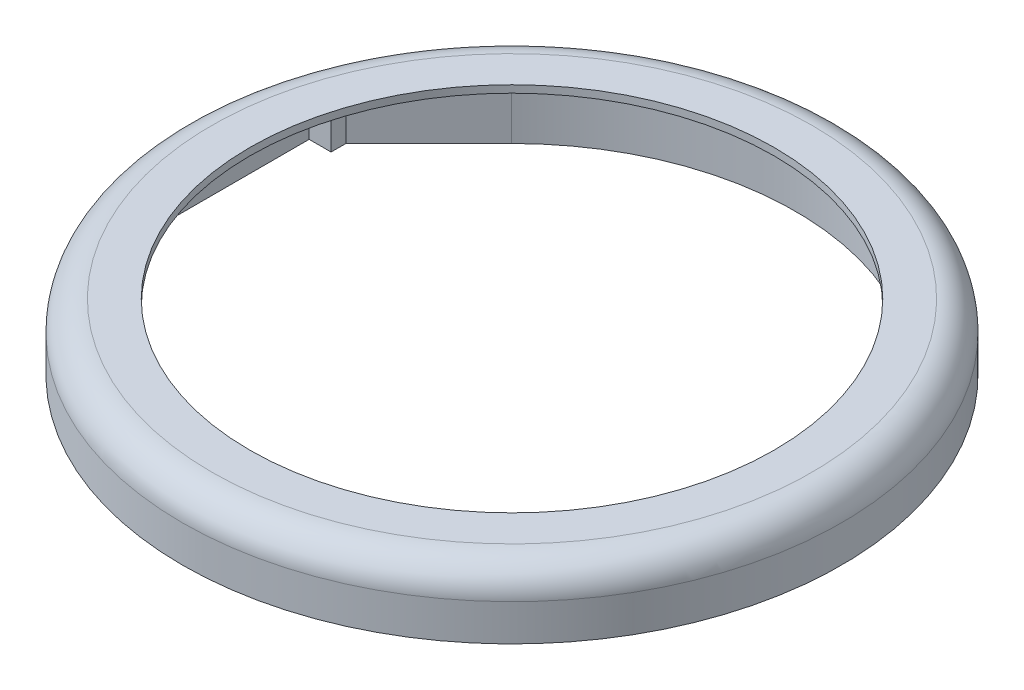
ISO-10303-21;
HEADER;
FILE_DESCRIPTION(('STEP AP214'),'2;1');
FILE_NAME('part.step','',(''),(''),'','','');
FILE_SCHEMA(('AUTOMOTIVE_DESIGN { 1 0 10303 214 1 1 1 1 }'));
ENDSEC;
DATA;
#1=APPLICATION_CONTEXT('core data for automotive mechanical design processes');
#2=APPLICATION_PROTOCOL_DEFINITION('international standard','automotive_design',2000,#1);
#3=PRODUCT_CONTEXT('',#1,'mechanical');
#4=PRODUCT('Part','Part','',(#3));
#5=PRODUCT_RELATED_PRODUCT_CATEGORY('part','',(#4));
#6=PRODUCT_DEFINITION_FORMATION('','',#4);
#7=PRODUCT_DEFINITION_CONTEXT('part definition',#1,'design');
#8=PRODUCT_DEFINITION('design','',#6,#7);
#9=PRODUCT_DEFINITION_SHAPE('','',#8);
#10=(LENGTH_UNIT() NAMED_UNIT(*) SI_UNIT(.MILLI.,.METRE.));
#11=(NAMED_UNIT(*) PLANE_ANGLE_UNIT() SI_UNIT($,.RADIAN.));
#12=(NAMED_UNIT(*) SI_UNIT($,.STERADIAN.) SOLID_ANGLE_UNIT());
#13=UNCERTAINTY_MEASURE_WITH_UNIT(LENGTH_MEASURE(1.E-05),#10,'distance_accuracy_value','');
#14=(GEOMETRIC_REPRESENTATION_CONTEXT(3) GLOBAL_UNCERTAINTY_ASSIGNED_CONTEXT((#13)) GLOBAL_UNIT_ASSIGNED_CONTEXT((#10,
#11,#12)) REPRESENTATION_CONTEXT('',''));
#15=CARTESIAN_POINT('',(0.,0.,0.));
#16=DIRECTION('',(0.,0.,1.));
#17=DIRECTION('',(1.,0.,0.));
#18=AXIS2_PLACEMENT_3D('',#15,#16,#17);
#19=CARTESIAN_POINT('',(19.8,4.,2.50000000000001));
#20=DIRECTION('',(0.,0.,1.));
#21=DIRECTION('',(1.,0.,0.));
#22=AXIS2_PLACEMENT_3D('',#19,#20,#21);
#23=PLANE('',#22);
#24=DIRECTION('',(-1.,0.,0.));
#25=VECTOR('',#24,1.);
#26=CARTESIAN_POINT('',(25.5426406871193,1.,2.5));
#27=LINE('',#26,#25);
#28=CARTESIAN_POINT('',(21.3,1.,2.5));
#29=VERTEX_POINT('',#28);
#30=CARTESIAN_POINT('',(19.8,1.,2.50000000000001));
#31=VERTEX_POINT('',#30);
#32=EDGE_CURVE('E558',#29,#31,#27,.T.);
#33=ORIENTED_EDGE('',*,*,#32,.F.);
#34=DIRECTION('',(0.,-1.,0.));
#35=VECTOR('',#34,1.);
#36=CARTESIAN_POINT('',(21.3,4.,2.5));
#37=LINE('',#36,#35);
#38=CARTESIAN_POINT('',(21.3,0.,2.5));
#39=VERTEX_POINT('',#38);
#40=EDGE_CURVE('E241',#29,#39,#37,.T.);
#41=ORIENTED_EDGE('',*,*,#40,.T.);
#42=DIRECTION('',(-1.,0.,0.));
#43=VECTOR('',#42,1.);
#44=CARTESIAN_POINT('',(19.8,0.,2.50000000000001));
#45=LINE('',#44,#43);
#46=CARTESIAN_POINT('',(19.8,0.,2.50000000000001));
#47=VERTEX_POINT('',#46);
#48=EDGE_CURVE('E251',#39,#47,#45,.T.);
#49=ORIENTED_EDGE('',*,*,#48,.T.);
#50=DIRECTION('',(0.,-1.,0.));
#51=VECTOR('',#50,1.);
#52=CARTESIAN_POINT('',(19.8,4.,2.50000000000001));
#53=LINE('',#52,#51);
#54=EDGE_CURVE('E275',#31,#47,#53,.T.);
#55=ORIENTED_EDGE('',*,*,#54,.F.);
#56=EDGE_LOOP('',(#33,#41,#49,#55));
#57=FACE_BOUND('',#56,.T.);
#58=ADVANCED_FACE('F45',(#57),#23,.F.);
#59=CARTESIAN_POINT('',(19.8,4.,-2.5));
#60=DIRECTION('',(0.,0.,-1.));
#61=DIRECTION('',(-1.,0.,0.));
#62=AXIS2_PLACEMENT_3D('',#59,#60,#61);
#63=PLANE('',#62);
#64=DIRECTION('',(-1.,0.,0.));
#65=VECTOR('',#64,1.);
#66=CARTESIAN_POINT('',(25.5426406871193,0.999999999999999,-2.49999999999999));
#67=LINE('',#66,#65);
#68=CARTESIAN_POINT('',(19.8,0.999999999999999,-2.5));
#69=VERTEX_POINT('',#68);
#70=CARTESIAN_POINT('',(21.3,0.999999999999999,-2.5));
#71=VERTEX_POINT('',#70);
#72=EDGE_CURVE('E553',#69,#71,#67,.F.);
#73=ORIENTED_EDGE('',*,*,#72,.F.);
#74=DIRECTION('',(0.,-1.,0.));
#75=VECTOR('',#74,1.);
#76=CARTESIAN_POINT('',(19.8,4.,-2.5));
#77=LINE('',#76,#75);
#78=CARTESIAN_POINT('',(19.8,0.,-2.5));
#79=VERTEX_POINT('',#78);
#80=EDGE_CURVE('E68',#69,#79,#77,.T.);
#81=ORIENTED_EDGE('',*,*,#80,.T.);
#82=DIRECTION('',(1.,0.,0.));
#83=VECTOR('',#82,1.);
#84=CARTESIAN_POINT('',(19.8,0.,-2.5));
#85=LINE('',#84,#83);
#86=CARTESIAN_POINT('',(21.3,0.,-2.5));
#87=VERTEX_POINT('',#86);
#88=EDGE_CURVE('E495',#79,#87,#85,.T.);
#89=ORIENTED_EDGE('',*,*,#88,.T.);
#90=DIRECTION('',(0.,-1.,0.));
#91=VECTOR('',#90,1.);
#92=CARTESIAN_POINT('',(21.3,4.,-2.5));
#93=LINE('',#92,#91);
#94=EDGE_CURVE('E483',#71,#87,#93,.T.);
#95=ORIENTED_EDGE('',*,*,#94,.F.);
#96=EDGE_LOOP('',(#73,#81,#89,#95));
#97=FACE_BOUND('',#96,.T.);
#98=ADVANCED_FACE('F381',(#97),#63,.F.);
#99=CARTESIAN_POINT('',(-12.8150635094612,4.,-17.1963411006085));
#100=DIRECTION('',(-0.866025403784436,0.,0.500000000000004));
#101=DIRECTION('',(0.500000000000004,0.,0.866025403784436));
#102=AXIS2_PLACEMENT_3D('',#99,#100,#101);
#103=PLANE('',#102);
#104=DIRECTION('',(0.500000000000004,0.,0.866025403784436));
#105=VECTOR('',#104,1.);
#106=CARTESIAN_POINT('',(-14.9363838530208,1.,-20.8705757147833));
#107=LINE('',#106,#105);
#108=CARTESIAN_POINT('',(-12.0650635094612,1.,-15.8973029949318));
#109=VERTEX_POINT('',#108);
#110=CARTESIAN_POINT('',(-12.8150635094612,1.,-17.1963411006085));
#111=VERTEX_POINT('',#110);
#112=EDGE_CURVE('E544',#109,#111,#107,.F.);
#113=ORIENTED_EDGE('',*,*,#112,.F.);
#114=DIRECTION('',(0.,-1.,0.));
#115=VECTOR('',#114,1.);
#116=CARTESIAN_POINT('',(-12.0650635094612,4.,-15.8973029949318));
#117=LINE('',#116,#115);
#118=CARTESIAN_POINT('',(-12.0650635094612,0.,-15.8973029949318));
#119=VERTEX_POINT('',#118);
#120=EDGE_CURVE('E259',#109,#119,#117,.T.);
#121=ORIENTED_EDGE('',*,*,#120,.T.);
#122=DIRECTION('',(-0.500000000000004,0.,-0.866025403784436));
#123=VECTOR('',#122,1.);
#124=CARTESIAN_POINT('',(-12.8150635094612,0.,-17.1963411006085));
#125=LINE('',#124,#123);
#126=CARTESIAN_POINT('',(-12.8150635094612,0.,-17.1963411006085));
#127=VERTEX_POINT('',#126);
#128=EDGE_CURVE('E272',#119,#127,#125,.T.);
#129=ORIENTED_EDGE('',*,*,#128,.T.);
#130=DIRECTION('',(0.,-1.,0.));
#131=VECTOR('',#130,1.);
#132=CARTESIAN_POINT('',(-12.8150635094612,4.,-17.1963411006085));
#133=LINE('',#132,#131);
#134=EDGE_CURVE('E252',#111,#127,#133,.T.);
#135=ORIENTED_EDGE('',*,*,#134,.F.);
#136=EDGE_LOOP('',(#113,#121,#129,#135));
#137=FACE_BOUND('',#136,.T.);
#138=ADVANCED_FACE('F388',(#137),#103,.F.);
#139=CARTESIAN_POINT('',(-8.484936490539,4.,-19.6963411006085));
#140=DIRECTION('',(0.866025403784434,0.,-0.500000000000007));
#141=DIRECTION('',(-0.500000000000007,0.,-0.866025403784434));
#142=AXIS2_PLACEMENT_3D('',#139,#140,#141);
#143=PLANE('',#142);
#144=DIRECTION('',(0.500000000000004,0.,0.866025403784436));
#145=VECTOR('',#144,1.);
#146=CARTESIAN_POINT('',(-10.6062568340987,1.,-23.3705757147833));
#147=LINE('',#146,#145);
#148=CARTESIAN_POINT('',(-8.484936490539,1.,-19.6963411006085));
#149=VERTEX_POINT('',#148);
#150=CARTESIAN_POINT('',(-7.73493649053899,1.,-18.3973029949319));
#151=VERTEX_POINT('',#150);
#152=EDGE_CURVE('E539',#149,#151,#147,.T.);
#153=ORIENTED_EDGE('',*,*,#152,.F.);
#154=DIRECTION('',(0.,-1.,0.));
#155=VECTOR('',#154,1.);
#156=CARTESIAN_POINT('',(-8.484936490539,4.,-19.6963411006085));
#157=LINE('',#156,#155);
#158=CARTESIAN_POINT('',(-8.484936490539,0.,-19.6963411006085));
#159=VERTEX_POINT('',#158);
#160=EDGE_CURVE('E255',#149,#159,#157,.T.);
#161=ORIENTED_EDGE('',*,*,#160,.T.);
#162=DIRECTION('',(0.500000000000007,0.,0.866025403784434));
#163=VECTOR('',#162,1.);
#164=CARTESIAN_POINT('',(-8.484936490539,0.,-19.6963411006085));
#165=LINE('',#164,#163);
#166=CARTESIAN_POINT('',(-7.73493649053899,0.,-18.3973029949319));
#167=VERTEX_POINT('',#166);
#168=EDGE_CURVE('E265',#159,#167,#165,.T.);
#169=ORIENTED_EDGE('',*,*,#168,.T.);
#170=DIRECTION('',(0.,-1.,0.));
#171=VECTOR('',#170,1.);
#172=CARTESIAN_POINT('',(-7.73493649053899,4.,-18.3973029949319));
#173=LINE('',#172,#171);
#174=EDGE_CURVE('E257',#151,#167,#173,.T.);
#175=ORIENTED_EDGE('',*,*,#174,.F.);
#176=EDGE_LOOP('',(#153,#161,#169,#175));
#177=FACE_BOUND('',#176,.T.);
#178=ADVANCED_FACE('F397',(#177),#143,.F.);
#179=CARTESIAN_POINT('',(-8.48493649053886,4.,19.6963411006086));
#180=DIRECTION('',(0.86602540378444,0.,0.499999999999997));
#181=DIRECTION('',(0.499999999999997,0.,-0.86602540378444));
#182=AXIS2_PLACEMENT_3D('',#179,#180,#181);
#183=PLANE('',#182);
#184=DIRECTION('',(0.499999999999998,0.,-0.86602540378444));
#185=VECTOR('',#184,1.);
#186=CARTESIAN_POINT('',(-10.6062568340985,1.,23.3705757147833));
#187=LINE('',#186,#185);
#188=CARTESIAN_POINT('',(-7.73493649053886,1.,18.3973029949319));
#189=VERTEX_POINT('',#188);
#190=CARTESIAN_POINT('',(-8.48493649053886,1.,19.6963411006086));
#191=VERTEX_POINT('',#190);
#192=EDGE_CURVE('E261',#189,#191,#187,.F.);
#193=ORIENTED_EDGE('',*,*,#192,.F.);
#194=DIRECTION('',(0.,-1.,0.));
#195=VECTOR('',#194,1.);
#196=CARTESIAN_POINT('',(-7.73493649053886,4.,18.3973029949319));
#197=LINE('',#196,#195);
#198=CARTESIAN_POINT('',(-7.73493649053886,0.,18.3973029949319));
#199=VERTEX_POINT('',#198);
#200=EDGE_CURVE('E514',#189,#199,#197,.T.);
#201=ORIENTED_EDGE('',*,*,#200,.T.);
#202=DIRECTION('',(-0.499999999999997,0.,0.86602540378444));
#203=VECTOR('',#202,1.);
#204=CARTESIAN_POINT('',(-8.48493649053886,0.,19.6963411006086));
#205=LINE('',#204,#203);
#206=CARTESIAN_POINT('',(-8.48493649053886,0.,19.6963411006086));
#207=VERTEX_POINT('',#206);
#208=EDGE_CURVE('E509',#199,#207,#205,.T.);
#209=ORIENTED_EDGE('',*,*,#208,.T.);
#210=DIRECTION('',(0.,-1.,0.));
#211=VECTOR('',#210,1.);
#212=CARTESIAN_POINT('',(-8.48493649053886,4.,19.6963411006086));
#213=LINE('',#212,#211);
#214=EDGE_CURVE('E295',#191,#207,#213,.T.);
#215=ORIENTED_EDGE('',*,*,#214,.F.);
#216=EDGE_LOOP('',(#193,#201,#209,#215));
#217=FACE_BOUND('',#216,.T.);
#218=ADVANCED_FACE('F404',(#217),#183,.F.);
#219=CARTESIAN_POINT('',(-12.8150635094611,4.,17.1963411006086));
#220=DIRECTION('',(-0.866025403784439,0.,-0.499999999999999));
#221=DIRECTION('',(-0.499999999999999,0.,0.866025403784439));
#222=AXIS2_PLACEMENT_3D('',#219,#220,#221);
#223=PLANE('',#222);
#224=DIRECTION('',(0.499999999999998,0.,-0.86602540378444));
#225=VECTOR('',#224,1.);
#226=CARTESIAN_POINT('',(-14.9363838530207,1.,20.8705757147833));
#227=LINE('',#226,#225);
#228=CARTESIAN_POINT('',(-12.8150635094611,1.,17.1963411006086));
#229=VERTEX_POINT('',#228);
#230=CARTESIAN_POINT('',(-12.0650635094611,1.,15.8973029949319));
#231=VERTEX_POINT('',#230);
#232=EDGE_CURVE('E531',#229,#231,#227,.T.);
#233=ORIENTED_EDGE('',*,*,#232,.F.);
#234=DIRECTION('',(0.,-1.,0.));
#235=VECTOR('',#234,1.);
#236=CARTESIAN_POINT('',(-12.8150635094611,4.,17.1963411006086));
#237=LINE('',#236,#235);
#238=CARTESIAN_POINT('',(-12.8150635094611,0.,17.1963411006086));
#239=VERTEX_POINT('',#238);
#240=EDGE_CURVE('E60',#229,#239,#237,.T.);
#241=ORIENTED_EDGE('',*,*,#240,.T.);
#242=DIRECTION('',(0.499999999999999,0.,-0.866025403784439));
#243=VECTOR('',#242,1.);
#244=CARTESIAN_POINT('',(-12.8150635094611,0.,17.1963411006086));
#245=LINE('',#244,#243);
#246=CARTESIAN_POINT('',(-12.0650635094611,0.,15.8973029949319));
#247=VERTEX_POINT('',#246);
#248=EDGE_CURVE('E497',#239,#247,#245,.T.);
#249=ORIENTED_EDGE('',*,*,#248,.T.);
#250=DIRECTION('',(0.,-1.,0.));
#251=VECTOR('',#250,1.);
#252=CARTESIAN_POINT('',(-12.0650635094611,4.,15.8973029949319));
#253=LINE('',#252,#251);
#254=EDGE_CURVE('E515',#231,#247,#253,.T.);
#255=ORIENTED_EDGE('',*,*,#254,.F.);
#256=EDGE_LOOP('',(#233,#241,#249,#255));
#257=FACE_BOUND('',#256,.T.);
#258=ADVANCED_FACE('F453',(#257),#223,.F.);
#259=CARTESIAN_POINT('',(0.,4.5,0.));
#260=DIRECTION('',(0.,-1.,0.));
#261=DIRECTION('',(0.,0.,-1.));
#262=AXIS2_PLACEMENT_3D('',#259,#260,#261);
#263=CYLINDRICAL_SURFACE('',#262,22.5);
#264=CARTESIAN_POINT('',(0.,2.5,0.));
#265=DIRECTION('',(0.,1.,0.));
#266=DIRECTION('',(0.,0.,1.));
#267=AXIS2_PLACEMENT_3D('',#264,#265,#266);
#268=CIRCLE('',#267,22.5);
#269=CARTESIAN_POINT('',(0.,2.5,22.5));
#270=VERTEX_POINT('',#269);
#271=EDGE_CURVE('E13',#270,#270,#268,.F.);
#272=ORIENTED_EDGE('',*,*,#271,.T.);
#273=EDGE_LOOP('',(#272));
#274=FACE_BOUND('',#273,.T.);
#275=CARTESIAN_POINT('',(0.,0.,0.));
#276=DIRECTION('',(0.,1.,0.));
#277=DIRECTION('',(0.,0.,1.));
#278=AXIS2_PLACEMENT_3D('',#275,#276,#277);
#279=CIRCLE('',#278,22.5);
#280=CARTESIAN_POINT('',(0.,0.,22.5));
#281=VERTEX_POINT('',#280);
#282=EDGE_CURVE('E353',#281,#281,#279,.T.);
#283=ORIENTED_EDGE('',*,*,#282,.T.);
#284=EDGE_LOOP('',(#283));
#285=FACE_BOUND('',#284,.T.);
#286=ADVANCED_FACE('F449',(#274,#285),#263,.T.);
#287=CARTESIAN_POINT('',(0.,4.5,0.));
#288=DIRECTION('',(0.,1.,0.));
#289=DIRECTION('',(0.,0.,1.));
#290=AXIS2_PLACEMENT_3D('',#287,#288,#289);
#291=PLANE('',#290);
#292=CARTESIAN_POINT('',(0.,4.5,0.));
#293=DIRECTION('',(0.,1.,0.));
#294=DIRECTION('',(0.,0.,1.));
#295=AXIS2_PLACEMENT_3D('',#292,#293,#294);
#296=CIRCLE('',#295,20.5);
#297=CARTESIAN_POINT('',(0.,4.5,20.5));
#298=VERTEX_POINT('',#297);
#299=EDGE_CURVE('E53',#298,#298,#296,.T.);
#300=ORIENTED_EDGE('',*,*,#299,.T.);
#301=EDGE_LOOP('',(#300));
#302=FACE_BOUND('',#301,.T.);
#303=CARTESIAN_POINT('',(0.,4.5,0.));
#304=DIRECTION('',(0.,1.,0.));
#305=DIRECTION('',(0.,0.,1.));
#306=AXIS2_PLACEMENT_3D('',#303,#304,#305);
#307=CIRCLE('',#306,17.9);
#308=CARTESIAN_POINT('',(0.,4.5,17.9));
#309=VERTEX_POINT('',#308);
#310=EDGE_CURVE('E350',#309,#309,#307,.T.);
#311=ORIENTED_EDGE('',*,*,#310,.F.);
#312=EDGE_LOOP('',(#311));
#313=FACE_BOUND('',#312,.T.);
#314=ADVANCED_FACE('F360',(#302,#313),#291,.T.);
#315=CARTESIAN_POINT('',(0.,0.,0.));
#316=DIRECTION('',(0.,1.,0.));
#317=DIRECTION('',(0.,0.,1.));
#318=AXIS2_PLACEMENT_3D('',#315,#316,#317);
#319=PLANE('',#318);
#320=ORIENTED_EDGE('',*,*,#248,.F.);
#321=DIRECTION('',(-0.86602540378444,0.,-0.499999999999998));
#322=VECTOR('',#321,1.);
#323=CARTESIAN_POINT('',(-12.8150635094611,0.,17.1963411006086));
#324=LINE('',#323,#322);
#325=EDGE_CURVE('E496',#207,#239,#324,.T.);
#326=ORIENTED_EDGE('',*,*,#325,.F.);
#327=ORIENTED_EDGE('',*,*,#208,.F.);
#328=DIRECTION('',(0.86602540378444,0.,0.499999999999998));
#329=VECTOR('',#328,1.);
#330=CARTESIAN_POINT('',(-12.0650635094611,0.,15.8973029949319));
#331=LINE('',#330,#329);
#332=EDGE_CURVE('E501',#247,#199,#331,.T.);
#333=ORIENTED_EDGE('',*,*,#332,.F.);
#334=EDGE_LOOP('',(#320,#326,#327,#333));
#335=FACE_BOUND('',#334,.T.);
#336=ORIENTED_EDGE('',*,*,#88,.F.);
#337=DIRECTION('',(0.,0.,-1.));
#338=VECTOR('',#337,1.);
#339=CARTESIAN_POINT('',(19.8,0.,2.50000000000001));
#340=LINE('',#339,#338);
#341=EDGE_CURVE('E481',#47,#79,#340,.T.);
#342=ORIENTED_EDGE('',*,*,#341,.F.);
#343=ORIENTED_EDGE('',*,*,#48,.F.);
#344=DIRECTION('',(0.,0.,1.));
#345=VECTOR('',#344,1.);
#346=CARTESIAN_POINT('',(21.3,0.,2.5));
#347=LINE('',#346,#345);
#348=EDGE_CURVE('E493',#87,#39,#347,.T.);
#349=ORIENTED_EDGE('',*,*,#348,.F.);
#350=EDGE_LOOP('',(#336,#342,#343,#349));
#351=FACE_BOUND('',#350,.T.);
#352=DIRECTION('',(0.866025403784438,0.,-0.500000000000002));
#353=VECTOR('',#352,1.);
#354=CARTESIAN_POINT('',(-12.8150635094612,0.,-17.1963411006085));
#355=LINE('',#354,#353);
#356=EDGE_CURVE('E269',#127,#159,#355,.T.);
#357=ORIENTED_EDGE('',*,*,#356,.F.);
#358=ORIENTED_EDGE('',*,*,#128,.F.);
#359=DIRECTION('',(-0.866025403784436,0.,0.500000000000004));
#360=VECTOR('',#359,1.);
#361=CARTESIAN_POINT('',(-12.0650635094612,0.,-15.8973029949318));
#362=LINE('',#361,#360);
#363=EDGE_CURVE('E262',#167,#119,#362,.T.);
#364=ORIENTED_EDGE('',*,*,#363,.F.);
#365=ORIENTED_EDGE('',*,*,#168,.F.);
#366=EDGE_LOOP('',(#357,#358,#364,#365));
#367=FACE_BOUND('',#366,.T.);
#368=DIRECTION('',(0.,0.,-1.));
#369=VECTOR('',#368,1.);
#370=CARTESIAN_POINT('',(-19.35,0.,-8.));
#371=LINE('',#370,#369);
#372=CARTESIAN_POINT('',(-19.35,0.,-7.));
#373=VERTEX_POINT('',#372);
#374=CARTESIAN_POINT('',(-19.35,0.,-8.));
#375=VERTEX_POINT('',#374);
#376=EDGE_CURVE('E322',#373,#375,#371,.T.);
#377=ORIENTED_EDGE('',*,*,#376,.F.);
#378=DIRECTION('',(1.,0.,0.));
#379=VECTOR('',#378,1.);
#380=CARTESIAN_POINT('',(-19.35,0.,-7.));
#381=LINE('',#380,#379);
#382=CARTESIAN_POINT('',(-20.85,0.,-7.));
#383=VERTEX_POINT('',#382);
#384=EDGE_CURVE('E290',#383,#373,#381,.T.);
#385=ORIENTED_EDGE('',*,*,#384,.F.);
#386=DIRECTION('',(0.,0.,-1.));
#387=VECTOR('',#386,1.);
#388=CARTESIAN_POINT('',(-20.85,0.,7.));
#389=LINE('',#388,#387);
#390=CARTESIAN_POINT('',(-20.85,0.,7.));
#391=VERTEX_POINT('',#390);
#392=EDGE_CURVE('E292',#391,#383,#389,.T.);
#393=ORIENTED_EDGE('',*,*,#392,.F.);
#394=DIRECTION('',(-1.,0.,0.));
#395=VECTOR('',#394,1.);
#396=CARTESIAN_POINT('',(-20.85,0.,7.));
#397=LINE('',#396,#395);
#398=CARTESIAN_POINT('',(-19.35,0.,7.));
#399=VERTEX_POINT('',#398);
#400=EDGE_CURVE('E286',#399,#391,#397,.T.);
#401=ORIENTED_EDGE('',*,*,#400,.F.);
#402=CARTESIAN_POINT('',(-19.35,0.,7.99999999999999));
#403=VERTEX_POINT('',#402);
#404=EDGE_CURVE('E319',#403,#399,#371,.T.);
#405=ORIENTED_EDGE('',*,*,#404,.F.);
#406=DIRECTION('',(-0.706168136899907,0.,-0.708044181126654));
#407=VECTOR('',#406,1.);
#408=CARTESIAN_POINT('',(-19.35,0.,7.99999999999999));
#409=LINE('',#408,#407);
#410=CARTESIAN_POINT('',(-13.7006549048007,0.,13.6643534490132));
#411=VERTEX_POINT('',#410);
#412=EDGE_CURVE('E323',#411,#403,#409,.T.);
#413=ORIENTED_EDGE('',*,*,#412,.F.);
#414=CARTESIAN_POINT('',(0.,0.,0.));
#415=DIRECTION('',(0.,-1.,0.));
#416=DIRECTION('',(0.,0.,-1.));
#417=AXIS2_PLACEMENT_3D('',#414,#415,#416);
#418=CIRCLE('',#417,19.35);
#419=CARTESIAN_POINT('',(-13.7006549048007,0.,-13.6643534490132));
#420=VERTEX_POINT('',#419);
#421=EDGE_CURVE('E315',#420,#411,#418,.T.);
#422=ORIENTED_EDGE('',*,*,#421,.F.);
#423=DIRECTION('',(0.706168136899906,0.,-0.708044181126655));
#424=VECTOR('',#423,1.);
#425=CARTESIAN_POINT('',(-13.7006549048007,0.,-13.6643534490133));
#426=LINE('',#425,#424);
#427=EDGE_CURVE('E316',#375,#420,#426,.T.);
#428=ORIENTED_EDGE('',*,*,#427,.F.);
#429=EDGE_LOOP('',(#377,#385,#393,#401,#405,#413,#422,#428));
#430=FACE_BOUND('',#429,.T.);
#431=ORIENTED_EDGE('',*,*,#282,.F.);
#432=EDGE_LOOP('',(#431));
#433=FACE_BOUND('',#432,.T.);
#434=ADVANCED_FACE('F445',(#335,#351,#367,#430,#433),#319,.F.);
#435=CARTESIAN_POINT('',(0.,0.,0.));
#436=DIRECTION('',(0.,1.,0.));
#437=DIRECTION('',(0.,0.,1.));
#438=AXIS2_PLACEMENT_3D('',#435,#436,#437);
#439=CYLINDRICAL_SURFACE('',#438,17.9);
#440=CARTESIAN_POINT('',(0.,4.,0.));
#441=DIRECTION('',(0.,1.,0.));
#442=DIRECTION('',(0.,0.,1.));
#443=AXIS2_PLACEMENT_3D('',#440,#441,#442);
#444=CIRCLE('',#443,17.9);
#445=CARTESIAN_POINT('',(0.,4.,17.9));
#446=VERTEX_POINT('',#445);
#447=EDGE_CURVE('E349',#446,#446,#444,.F.);
#448=ORIENTED_EDGE('',*,*,#447,.T.);
#449=EDGE_LOOP('',(#448));
#450=FACE_BOUND('',#449,.T.);
#451=ORIENTED_EDGE('',*,*,#310,.T.);
#452=EDGE_LOOP('',(#451));
#453=FACE_BOUND('',#452,.T.);
#454=ADVANCED_FACE('F441',(#450,#453),#439,.F.);
#455=CARTESIAN_POINT('',(0.,4.,0.));
#456=DIRECTION('',(0.,1.,0.));
#457=DIRECTION('',(0.,0.,1.));
#458=AXIS2_PLACEMENT_3D('',#455,#456,#457);
#459=PLANE('',#458);
#460=CARTESIAN_POINT('',(0.,4.,0.));
#461=DIRECTION('',(0.,1.,0.));
#462=DIRECTION('',(0.,0.,1.));
#463=AXIS2_PLACEMENT_3D('',#460,#461,#462);
#464=CIRCLE('',#463,19.35);
#465=CARTESIAN_POINT('',(-13.7006549048007,4.,-13.6643534490133));
#466=VERTEX_POINT('',#465);
#467=CARTESIAN_POINT('',(-13.7006549048007,4.,13.6643534490132));
#468=VERTEX_POINT('',#467);
#469=EDGE_CURVE('E331',#466,#468,#464,.F.);
#470=ORIENTED_EDGE('',*,*,#469,.T.);
#471=DIRECTION('',(-0.706168136899907,0.,-0.708044181126654));
#472=VECTOR('',#471,1.);
#473=CARTESIAN_POINT('',(-19.35,4.,7.99999999999999));
#474=LINE('',#473,#472);
#475=CARTESIAN_POINT('',(-19.35,4.00000000000002,7.99999999999999));
#476=VERTEX_POINT('',#475);
#477=EDGE_CURVE('E318',#468,#476,#474,.T.);
#478=ORIENTED_EDGE('',*,*,#477,.T.);
#479=DIRECTION('',(0.,0.,-1.));
#480=VECTOR('',#479,1.);
#481=CARTESIAN_POINT('',(-19.35,4.,-8.));
#482=LINE('',#481,#480);
#483=CARTESIAN_POINT('',(-19.35,4.,-8.));
#484=VERTEX_POINT('',#483);
#485=EDGE_CURVE('E340',#476,#484,#482,.T.);
#486=ORIENTED_EDGE('',*,*,#485,.T.);
#487=DIRECTION('',(0.706168136899906,0.,-0.708044181126655));
#488=VECTOR('',#487,1.);
#489=CARTESIAN_POINT('',(-13.7006549048007,4.,-13.6643534490133));
#490=LINE('',#489,#488);
#491=EDGE_CURVE('E336',#484,#466,#490,.T.);
#492=ORIENTED_EDGE('',*,*,#491,.T.);
#493=EDGE_LOOP('',(#470,#478,#486,#492));
#494=FACE_BOUND('',#493,.T.);
#495=ORIENTED_EDGE('',*,*,#447,.F.);
#496=EDGE_LOOP('',(#495));
#497=FACE_BOUND('',#496,.T.);
#498=ADVANCED_FACE('F437',(#494,#497),#459,.F.);
#499=CARTESIAN_POINT('',(-19.35,59.2300648638388,7.99999999999999));
#500=DIRECTION('',(-0.708044181126654,0.,0.706168136899907));
#501=DIRECTION('',(0.706168136899907,0.,0.708044181126654));
#502=AXIS2_PLACEMENT_3D('',#499,#500,#501);
#503=PLANE('',#502);
#504=DIRECTION('',(0.,-1.,0.));
#505=VECTOR('',#504,1.);
#506=CARTESIAN_POINT('',(-13.7006549048007,59.2300648638388,13.6643534490132));
#507=LINE('',#506,#505);
#508=EDGE_CURVE('E334',#468,#411,#507,.T.);
#509=ORIENTED_EDGE('',*,*,#508,.T.);
#510=ORIENTED_EDGE('',*,*,#412,.T.);
#511=DIRECTION('',(0.,-1.,0.));
#512=VECTOR('',#511,1.);
#513=CARTESIAN_POINT('',(-19.35,59.2300648638388,7.99999999999999));
#514=LINE('',#513,#512);
#515=EDGE_CURVE('E330',#476,#403,#514,.T.);
#516=ORIENTED_EDGE('',*,*,#515,.F.);
#517=ORIENTED_EDGE('',*,*,#477,.F.);
#518=EDGE_LOOP('',(#509,#510,#516,#517));
#519=FACE_BOUND('',#518,.T.);
#520=ADVANCED_FACE('F433',(#519),#503,.F.);
#521=CARTESIAN_POINT('',(-19.35,59.2300648638388,-8.));
#522=DIRECTION('',(-1.,0.,0.));
#523=DIRECTION('',(0.,0.,1.));
#524=AXIS2_PLACEMENT_3D('',#521,#522,#523);
#525=PLANE('',#524);
#526=DIRECTION('',(0.,0.,1.));
#527=VECTOR('',#526,1.);
#528=CARTESIAN_POINT('',(-19.35,3.2,7.));
#529=LINE('',#528,#527);
#530=CARTESIAN_POINT('',(-19.35,3.2,-7.));
#531=VERTEX_POINT('',#530);
#532=CARTESIAN_POINT('',(-19.35,3.2,7.));
#533=VERTEX_POINT('',#532);
#534=EDGE_CURVE('E308',#531,#533,#529,.T.);
#535=ORIENTED_EDGE('',*,*,#534,.F.);
#536=DIRECTION('',(0.,-1.,0.));
#537=VECTOR('',#536,1.);
#538=CARTESIAN_POINT('',(-19.35,18.0801278403287,-7.));
#539=LINE('',#538,#537);
#540=EDGE_CURVE('E298',#531,#373,#539,.T.);
#541=ORIENTED_EDGE('',*,*,#540,.T.);
#542=ORIENTED_EDGE('',*,*,#376,.T.);
#543=DIRECTION('',(0.,-1.,0.));
#544=VECTOR('',#543,1.);
#545=CARTESIAN_POINT('',(-19.35,59.2300648638388,-8.));
#546=LINE('',#545,#544);
#547=EDGE_CURVE('E339',#484,#375,#546,.T.);
#548=ORIENTED_EDGE('',*,*,#547,.F.);
#549=ORIENTED_EDGE('',*,*,#485,.F.);
#550=ORIENTED_EDGE('',*,*,#515,.T.);
#551=ORIENTED_EDGE('',*,*,#404,.T.);
#552=DIRECTION('',(0.,-1.,0.));
#553=VECTOR('',#552,1.);
#554=CARTESIAN_POINT('',(-19.35,18.0801278403287,7.));
#555=LINE('',#554,#553);
#556=EDGE_CURVE('E307',#533,#399,#555,.T.);
#557=ORIENTED_EDGE('',*,*,#556,.F.);
#558=EDGE_LOOP('',(#535,#541,#542,#548,#549,#550,#551,#557));
#559=FACE_BOUND('',#558,.T.);
#560=ADVANCED_FACE('F429',(#559),#525,.F.);
#561=CARTESIAN_POINT('',(-13.7006549048007,59.2300648638388,-13.6643534490133));
#562=DIRECTION('',(-0.708044181126655,0.,-0.706168136899906));
#563=DIRECTION('',(-0.706168136899906,0.,0.708044181126655));
#564=AXIS2_PLACEMENT_3D('',#561,#562,#563);
#565=PLANE('',#564);
#566=ORIENTED_EDGE('',*,*,#547,.T.);
#567=ORIENTED_EDGE('',*,*,#427,.T.);
#568=DIRECTION('',(0.,-1.,0.));
#569=VECTOR('',#568,1.);
#570=CARTESIAN_POINT('',(-13.7006549048007,59.2300648638388,-13.6643534490133));
#571=LINE('',#570,#569);
#572=EDGE_CURVE('E335',#466,#420,#571,.T.);
#573=ORIENTED_EDGE('',*,*,#572,.F.);
#574=ORIENTED_EDGE('',*,*,#491,.F.);
#575=EDGE_LOOP('',(#566,#567,#573,#574));
#576=FACE_BOUND('',#575,.T.);
#577=ADVANCED_FACE('F425',(#576),#565,.F.);
#578=CARTESIAN_POINT('',(0.,59.2300648638388,0.));
#579=DIRECTION('',(0.,-1.,0.));
#580=DIRECTION('',(0.,0.,-1.));
#581=AXIS2_PLACEMENT_3D('',#578,#579,#580);
#582=CYLINDRICAL_SURFACE('',#581,19.35);
#583=ORIENTED_EDGE('',*,*,#572,.T.);
#584=ORIENTED_EDGE('',*,*,#421,.T.);
#585=ORIENTED_EDGE('',*,*,#508,.F.);
#586=ORIENTED_EDGE('',*,*,#469,.F.);
#587=EDGE_LOOP('',(#583,#584,#585,#586));
#588=FACE_BOUND('',#587,.T.);
#589=ADVANCED_FACE('F421',(#588),#582,.F.);
#590=CARTESIAN_POINT('',(0.,3.2,0.));
#591=DIRECTION('',(0.,1.,0.));
#592=DIRECTION('',(0.,0.,1.));
#593=AXIS2_PLACEMENT_3D('',#590,#591,#592);
#594=PLANE('',#593);
#595=DIRECTION('',(0.,0.,-1.));
#596=VECTOR('',#595,1.);
#597=CARTESIAN_POINT('',(-20.85,3.2,7.));
#598=LINE('',#597,#596);
#599=CARTESIAN_POINT('',(-20.85,3.2,7.));
#600=VERTEX_POINT('',#599);
#601=CARTESIAN_POINT('',(-20.85,3.2,-7.));
#602=VERTEX_POINT('',#601);
#603=EDGE_CURVE('E299',#600,#602,#598,.T.);
#604=ORIENTED_EDGE('',*,*,#603,.T.);
#605=DIRECTION('',(1.,0.,0.));
#606=VECTOR('',#605,1.);
#607=CARTESIAN_POINT('',(-19.35,3.2,-7.));
#608=LINE('',#607,#606);
#609=EDGE_CURVE('E289',#602,#531,#608,.T.);
#610=ORIENTED_EDGE('',*,*,#609,.T.);
#611=ORIENTED_EDGE('',*,*,#534,.T.);
#612=DIRECTION('',(-1.,0.,0.));
#613=VECTOR('',#612,1.);
#614=CARTESIAN_POINT('',(-20.85,3.2,7.));
#615=LINE('',#614,#613);
#616=EDGE_CURVE('E304',#533,#600,#615,.T.);
#617=ORIENTED_EDGE('',*,*,#616,.T.);
#618=EDGE_LOOP('',(#604,#610,#611,#617));
#619=FACE_BOUND('',#618,.T.);
#620=ADVANCED_FACE('F417',(#619),#594,.F.);
#621=CARTESIAN_POINT('',(-19.35,18.0801278403287,-7.));
#622=DIRECTION('',(0.,0.,-1.));
#623=DIRECTION('',(-1.,0.,0.));
#624=AXIS2_PLACEMENT_3D('',#621,#622,#623);
#625=PLANE('',#624);
#626=DIRECTION('',(0.,-1.,0.));
#627=VECTOR('',#626,1.);
#628=CARTESIAN_POINT('',(-20.85,18.0801278403287,-7.));
#629=LINE('',#628,#627);
#630=EDGE_CURVE('E302',#602,#383,#629,.T.);
#631=ORIENTED_EDGE('',*,*,#630,.T.);
#632=ORIENTED_EDGE('',*,*,#384,.T.);
#633=ORIENTED_EDGE('',*,*,#540,.F.);
#634=ORIENTED_EDGE('',*,*,#609,.F.);
#635=EDGE_LOOP('',(#631,#632,#633,#634));
#636=FACE_BOUND('',#635,.T.);
#637=ADVANCED_FACE('F413',(#636),#625,.F.);
#638=CARTESIAN_POINT('',(-20.85,18.0801278403287,7.));
#639=DIRECTION('',(0.,0.,1.));
#640=DIRECTION('',(1.,0.,0.));
#641=AXIS2_PLACEMENT_3D('',#638,#639,#640);
#642=PLANE('',#641);
#643=ORIENTED_EDGE('',*,*,#556,.T.);
#644=ORIENTED_EDGE('',*,*,#400,.T.);
#645=DIRECTION('',(0.,-1.,0.));
#646=VECTOR('',#645,1.);
#647=CARTESIAN_POINT('',(-20.85,18.0801278403287,7.));
#648=LINE('',#647,#646);
#649=EDGE_CURVE('E303',#600,#391,#648,.T.);
#650=ORIENTED_EDGE('',*,*,#649,.F.);
#651=ORIENTED_EDGE('',*,*,#616,.F.);
#652=EDGE_LOOP('',(#643,#644,#650,#651));
#653=FACE_BOUND('',#652,.T.);
#654=ADVANCED_FACE('F376',(#653),#642,.F.);
#655=CARTESIAN_POINT('',(-20.85,18.0801278403287,7.));
#656=DIRECTION('',(-1.,0.,0.));
#657=DIRECTION('',(0.,0.,1.));
#658=AXIS2_PLACEMENT_3D('',#655,#656,#657);
#659=PLANE('',#658);
#660=ORIENTED_EDGE('',*,*,#649,.T.);
#661=ORIENTED_EDGE('',*,*,#392,.T.);
#662=ORIENTED_EDGE('',*,*,#630,.F.);
#663=ORIENTED_EDGE('',*,*,#603,.F.);
#664=EDGE_LOOP('',(#660,#661,#662,#663));
#665=FACE_BOUND('',#664,.T.);
#666=ADVANCED_FACE('F365',(#665),#659,.F.);
#667=CARTESIAN_POINT('',(0.,2.5,0.));
#668=DIRECTION('',(0.,1.,0.));
#669=DIRECTION('',(0.,0.,1.));
#670=AXIS2_PLACEMENT_3D('',#667,#668,#669);
#671=TOROIDAL_SURFACE('',#670,20.5,2.);
#672=ORIENTED_EDGE('',*,*,#271,.F.);
#673=EDGE_LOOP('',(#672));
#674=FACE_BOUND('',#673,.T.);
#675=ORIENTED_EDGE('',*,*,#299,.F.);
#676=EDGE_LOOP('',(#675));
#677=FACE_BOUND('',#676,.T.);
#678=ADVANCED_FACE('F47',(#674,#677),#671,.T.);
#679=CARTESIAN_POINT('',(-12.0650635094612,4.,-15.8973029949318));
#680=DIRECTION('',(0.500000000000004,0.,0.866025403784436));
#681=DIRECTION('',(0.866025403784436,0.,-0.500000000000004));
#682=AXIS2_PLACEMENT_3D('',#679,#680,#681);
#683=PLANE('',#682);
#684=DIRECTION('',(-0.866025403784436,0.,0.500000000000004));
#685=VECTOR('',#684,1.);
#686=CARTESIAN_POINT('',(-12.0650635094612,4.,-15.8973029949318));
#687=LINE('',#686,#685);
#688=CARTESIAN_POINT('',(-7.73493649053899,4.,-18.3973029949319));
#689=VERTEX_POINT('',#688);
#690=CARTESIAN_POINT('',(-12.0650635094612,4.,-15.8973029949318));
#691=VERTEX_POINT('',#690);
#692=EDGE_CURVE('E254',#689,#691,#687,.T.);
#693=ORIENTED_EDGE('',*,*,#692,.F.);
#694=CARTESIAN_POINT('',(-7.73493649053899,2.5,-18.3973029949319));
#695=DIRECTION('',(-0.500000000000004,0.,-0.866025403784436));
#696=DIRECTION('',(-0.866025403784436,0.,0.500000000000004));
#697=AXIS2_PLACEMENT_3D('',#694,#695,#696);
#698=CIRCLE('',#697,1.5);
#699=EDGE_CURVE('E550',#689,#151,#698,.T.);
#700=ORIENTED_EDGE('',*,*,#699,.T.);
#701=ORIENTED_EDGE('',*,*,#174,.T.);
#702=ORIENTED_EDGE('',*,*,#363,.T.);
#703=ORIENTED_EDGE('',*,*,#120,.F.);
#704=CARTESIAN_POINT('',(-12.0650635094612,2.5,-15.8973029949318));
#705=DIRECTION('',(-0.500000000000004,0.,-0.866025403784436));
#706=DIRECTION('',(-0.866025403784436,0.,0.500000000000004));
#707=AXIS2_PLACEMENT_3D('',#704,#705,#706);
#708=CIRCLE('',#707,1.5);
#709=EDGE_CURVE('E547',#109,#691,#708,.T.);
#710=ORIENTED_EDGE('',*,*,#709,.T.);
#711=EDGE_LOOP('',(#693,#700,#701,#702,#703,#710));
#712=FACE_BOUND('',#711,.T.);
#713=ADVANCED_FACE('F364',(#712),#683,.F.);
#714=CARTESIAN_POINT('',(-12.8150635094612,4.,-17.1963411006085));
#715=DIRECTION('',(-0.500000000000002,0.,-0.866025403784438));
#716=DIRECTION('',(-0.866025403784438,0.,0.500000000000002));
#717=AXIS2_PLACEMENT_3D('',#714,#715,#716);
#718=PLANE('',#717);
#719=ORIENTED_EDGE('',*,*,#160,.F.);
#720=CARTESIAN_POINT('',(-8.48493649053899,2.5,-19.6963411006085));
#721=DIRECTION('',(-0.500000000000002,0.,-0.866025403784438));
#722=DIRECTION('',(-0.866025403784438,0.,0.500000000000002));
#723=AXIS2_PLACEMENT_3D('',#720,#721,#722);
#724=CIRCLE('',#723,1.5);
#725=CARTESIAN_POINT('',(-8.48493649053899,4.,-19.6963411006085));
#726=VERTEX_POINT('',#725);
#727=EDGE_CURVE('E546',#726,#149,#724,.T.);
#728=ORIENTED_EDGE('',*,*,#727,.F.);
#729=DIRECTION('',(0.866025403784438,0.,-0.500000000000002));
#730=VECTOR('',#729,1.);
#731=CARTESIAN_POINT('',(-12.8150635094612,4.,-17.1963411006085));
#732=LINE('',#731,#730);
#733=CARTESIAN_POINT('',(-12.8150635094612,4.,-17.1963411006085));
#734=VERTEX_POINT('',#733);
#735=EDGE_CURVE('E281',#734,#726,#732,.T.);
#736=ORIENTED_EDGE('',*,*,#735,.F.);
#737=CARTESIAN_POINT('',(-12.8150635094612,2.5,-17.1963411006085));
#738=DIRECTION('',(-0.500000000000002,0.,-0.866025403784438));
#739=DIRECTION('',(-0.866025403784438,0.,0.500000000000002));
#740=AXIS2_PLACEMENT_3D('',#737,#738,#739);
#741=CIRCLE('',#740,1.5);
#742=EDGE_CURVE('E551',#111,#734,#741,.T.);
#743=ORIENTED_EDGE('',*,*,#742,.F.);
#744=ORIENTED_EDGE('',*,*,#134,.T.);
#745=ORIENTED_EDGE('',*,*,#356,.T.);
#746=EDGE_LOOP('',(#719,#728,#736,#743,#744,#745));
#747=FACE_BOUND('',#746,.T.);
#748=ADVANCED_FACE('F372',(#747),#718,.F.);
#749=CARTESIAN_POINT('',(0.,4.,0.));
#750=DIRECTION('',(0.,1.,0.));
#751=DIRECTION('',(0.,0.,1.));
#752=AXIS2_PLACEMENT_3D('',#749,#750,#751);
#753=PLANE('',#752);
#754=DIRECTION('',(-0.500000000000004,0.,-0.866025403784436));
#755=VECTOR('',#754,1.);
#756=CARTESIAN_POINT('',(-12.8150635094612,4.,-17.1963411006085));
#757=LINE('',#756,#755);
#758=EDGE_CURVE('E266',#691,#734,#757,.T.);
#759=ORIENTED_EDGE('',*,*,#758,.T.);
#760=ORIENTED_EDGE('',*,*,#735,.T.);
#761=DIRECTION('',(0.500000000000007,0.,0.866025403784434));
#762=VECTOR('',#761,1.);
#763=CARTESIAN_POINT('',(-8.484936490539,4.,-19.6963411006085));
#764=LINE('',#763,#762);
#765=EDGE_CURVE('E278',#726,#689,#764,.T.);
#766=ORIENTED_EDGE('',*,*,#765,.T.);
#767=ORIENTED_EDGE('',*,*,#692,.T.);
#768=EDGE_LOOP('',(#759,#760,#766,#767));
#769=FACE_BOUND('',#768,.T.);
#770=ADVANCED_FACE('F401',(#769),#753,.F.);
#771=CARTESIAN_POINT('',(19.8,4.,2.50000000000001));
#772=DIRECTION('',(-1.,0.,0.));
#773=DIRECTION('',(0.,0.,1.));
#774=AXIS2_PLACEMENT_3D('',#771,#772,#773);
#775=PLANE('',#774);
#776=ORIENTED_EDGE('',*,*,#80,.F.);
#777=CARTESIAN_POINT('',(19.8,2.5,-2.5));
#778=DIRECTION('',(1.,0.,0.));
#779=DIRECTION('',(0.,0.,-1.));
#780=AXIS2_PLACEMENT_3D('',#777,#778,#779);
#781=CIRCLE('',#780,1.5);
#782=CARTESIAN_POINT('',(19.8,4.,-2.5));
#783=VERTEX_POINT('',#782);
#784=EDGE_CURVE('E479',#69,#783,#781,.T.);
#785=ORIENTED_EDGE('',*,*,#784,.T.);
#786=DIRECTION('',(0.,0.,-1.));
#787=VECTOR('',#786,1.);
#788=CARTESIAN_POINT('',(19.8,4.,2.50000000000001));
#789=LINE('',#788,#787);
#790=CARTESIAN_POINT('',(19.8,4.,2.50000000000001));
#791=VERTEX_POINT('',#790);
#792=EDGE_CURVE('E246',#791,#783,#789,.T.);
#793=ORIENTED_EDGE('',*,*,#792,.F.);
#794=CARTESIAN_POINT('',(19.8,2.5,2.50000000000001));
#795=DIRECTION('',(1.,0.,0.));
#796=DIRECTION('',(0.,0.,-1.));
#797=AXIS2_PLACEMENT_3D('',#794,#795,#796);
#798=CIRCLE('',#797,1.5);
#799=EDGE_CURVE('E227',#791,#31,#798,.T.);
#800=ORIENTED_EDGE('',*,*,#799,.T.);
#801=ORIENTED_EDGE('',*,*,#54,.T.);
#802=ORIENTED_EDGE('',*,*,#341,.T.);
#803=EDGE_LOOP('',(#776,#785,#793,#800,#801,#802));
#804=FACE_BOUND('',#803,.T.);
#805=ADVANCED_FACE('F408',(#804),#775,.F.);
#806=CARTESIAN_POINT('',(21.3,4.,2.5));
#807=DIRECTION('',(1.,0.,0.));
#808=DIRECTION('',(0.,0.,-1.));
#809=AXIS2_PLACEMENT_3D('',#806,#807,#808);
#810=PLANE('',#809);
#811=DIRECTION('',(0.,0.,1.));
#812=VECTOR('',#811,1.);
#813=CARTESIAN_POINT('',(21.3,4.,2.5));
#814=LINE('',#813,#812);
#815=CARTESIAN_POINT('',(21.3,4.,-2.5));
#816=VERTEX_POINT('',#815);
#817=CARTESIAN_POINT('',(21.3,4.,2.50000000000001));
#818=VERTEX_POINT('',#817);
#819=EDGE_CURVE('E232',#816,#818,#814,.T.);
#820=ORIENTED_EDGE('',*,*,#819,.F.);
#821=CARTESIAN_POINT('',(21.3,2.5,-2.5));
#822=DIRECTION('',(1.,0.,0.));
#823=DIRECTION('',(0.,0.,-1.));
#824=AXIS2_PLACEMENT_3D('',#821,#822,#823);
#825=CIRCLE('',#824,1.5);
#826=EDGE_CURVE('E560',#71,#816,#825,.T.);
#827=ORIENTED_EDGE('',*,*,#826,.F.);
#828=ORIENTED_EDGE('',*,*,#94,.T.);
#829=ORIENTED_EDGE('',*,*,#348,.T.);
#830=ORIENTED_EDGE('',*,*,#40,.F.);
#831=CARTESIAN_POINT('',(21.3,2.5,2.50000000000001));
#832=DIRECTION('',(1.,0.,0.));
#833=DIRECTION('',(0.,0.,-1.));
#834=AXIS2_PLACEMENT_3D('',#831,#832,#833);
#835=CIRCLE('',#834,1.5);
#836=EDGE_CURVE('E224',#818,#29,#835,.T.);
#837=ORIENTED_EDGE('',*,*,#836,.F.);
#838=EDGE_LOOP('',(#820,#827,#828,#829,#830,#837));
#839=FACE_BOUND('',#838,.T.);
#840=ADVANCED_FACE('F237',(#839),#810,.F.);
#841=CARTESIAN_POINT('',(0.,4.,0.));
#842=DIRECTION('',(0.,-1.,0.));
#843=DIRECTION('',(0.,0.,-1.));
#844=AXIS2_PLACEMENT_3D('',#841,#842,#843);
#845=PLANE('',#844);
#846=ORIENTED_EDGE('',*,*,#792,.T.);
#847=DIRECTION('',(1.,0.,0.));
#848=VECTOR('',#847,1.);
#849=CARTESIAN_POINT('',(19.8,4.,-2.5));
#850=LINE('',#849,#848);
#851=EDGE_CURVE('E244',#783,#816,#850,.T.);
#852=ORIENTED_EDGE('',*,*,#851,.T.);
#853=ORIENTED_EDGE('',*,*,#819,.T.);
#854=DIRECTION('',(-1.,0.,0.));
#855=VECTOR('',#854,1.);
#856=CARTESIAN_POINT('',(19.8,4.,2.50000000000001));
#857=LINE('',#856,#855);
#858=EDGE_CURVE('E221',#818,#791,#857,.T.);
#859=ORIENTED_EDGE('',*,*,#858,.T.);
#860=EDGE_LOOP('',(#846,#852,#853,#859));
#861=FACE_BOUND('',#860,.T.);
#862=ADVANCED_FACE('F243',(#861),#845,.T.);
#863=CARTESIAN_POINT('',(-12.8150635094611,4.,17.1963411006086));
#864=DIRECTION('',(-0.499999999999998,0.,0.86602540378444));
#865=DIRECTION('',(0.86602540378444,0.,0.499999999999998));
#866=AXIS2_PLACEMENT_3D('',#863,#864,#865);
#867=PLANE('',#866);
#868=DIRECTION('',(-0.86602540378444,0.,-0.499999999999998));
#869=VECTOR('',#868,1.);
#870=CARTESIAN_POINT('',(-12.8150635094611,4.,17.1963411006086));
#871=LINE('',#870,#869);
#872=CARTESIAN_POINT('',(-8.48493649053886,4.,19.6963411006086));
#873=VERTEX_POINT('',#872);
#874=CARTESIAN_POINT('',(-12.8150635094611,4.,17.1963411006086));
#875=VERTEX_POINT('',#874);
#876=EDGE_CURVE('E512',#873,#875,#871,.T.);
#877=ORIENTED_EDGE('',*,*,#876,.F.);
#878=CARTESIAN_POINT('',(-8.48493649053886,2.5,19.6963411006086));
#879=DIRECTION('',(-0.499999999999998,0.,0.86602540378444));
#880=DIRECTION('',(0.86602540378444,0.,0.499999999999998));
#881=AXIS2_PLACEMENT_3D('',#878,#879,#880);
#882=CIRCLE('',#881,1.5);
#883=EDGE_CURVE('E533',#191,#873,#882,.T.);
#884=ORIENTED_EDGE('',*,*,#883,.F.);
#885=ORIENTED_EDGE('',*,*,#214,.T.);
#886=ORIENTED_EDGE('',*,*,#325,.T.);
#887=ORIENTED_EDGE('',*,*,#240,.F.);
#888=CARTESIAN_POINT('',(-12.8150635094611,2.5,17.1963411006086));
#889=DIRECTION('',(-0.499999999999998,0.,0.86602540378444));
#890=DIRECTION('',(0.86602540378444,0.,0.499999999999998));
#891=AXIS2_PLACEMENT_3D('',#888,#889,#890);
#892=CIRCLE('',#891,1.5);
#893=EDGE_CURVE('E537',#875,#229,#892,.T.);
#894=ORIENTED_EDGE('',*,*,#893,.F.);
#895=EDGE_LOOP('',(#877,#884,#885,#886,#887,#894));
#896=FACE_BOUND('',#895,.T.);
#897=ADVANCED_FACE('F394',(#896),#867,.F.);
#898=CARTESIAN_POINT('',(-12.0650635094611,4.,15.8973029949319));
#899=DIRECTION('',(0.499999999999998,0.,-0.86602540378444));
#900=DIRECTION('',(-0.86602540378444,0.,-0.499999999999998));
#901=AXIS2_PLACEMENT_3D('',#898,#899,#900);
#902=PLANE('',#901);
#903=ORIENTED_EDGE('',*,*,#200,.F.);
#904=CARTESIAN_POINT('',(-7.73493649053886,2.5,18.3973029949319));
#905=DIRECTION('',(-0.499999999999998,0.,0.86602540378444));
#906=DIRECTION('',(0.86602540378444,0.,0.499999999999998));
#907=AXIS2_PLACEMENT_3D('',#904,#905,#906);
#908=CIRCLE('',#907,1.5);
#909=CARTESIAN_POINT('',(-7.73493649053886,4.,18.3973029949319));
#910=VERTEX_POINT('',#909);
#911=EDGE_CURVE('E536',#189,#910,#908,.T.);
#912=ORIENTED_EDGE('',*,*,#911,.T.);
#913=DIRECTION('',(0.86602540378444,0.,0.499999999999998));
#914=VECTOR('',#913,1.);
#915=CARTESIAN_POINT('',(-12.0650635094611,4.,15.8973029949319));
#916=LINE('',#915,#914);
#917=CARTESIAN_POINT('',(-12.0650635094611,4.,15.8973029949319));
#918=VERTEX_POINT('',#917);
#919=EDGE_CURVE('E520',#918,#910,#916,.T.);
#920=ORIENTED_EDGE('',*,*,#919,.F.);
#921=CARTESIAN_POINT('',(-12.0650635094611,2.5,15.8973029949319));
#922=DIRECTION('',(-0.499999999999998,0.,0.86602540378444));
#923=DIRECTION('',(0.86602540378444,0.,0.499999999999998));
#924=AXIS2_PLACEMENT_3D('',#921,#922,#923);
#925=CIRCLE('',#924,1.5);
#926=EDGE_CURVE('E534',#918,#231,#925,.T.);
#927=ORIENTED_EDGE('',*,*,#926,.T.);
#928=ORIENTED_EDGE('',*,*,#254,.T.);
#929=ORIENTED_EDGE('',*,*,#332,.T.);
#930=EDGE_LOOP('',(#903,#912,#920,#927,#928,#929));
#931=FACE_BOUND('',#930,.T.);
#932=ADVANCED_FACE('F470',(#931),#902,.F.);
#933=CARTESIAN_POINT('',(0.,4.,0.));
#934=DIRECTION('',(0.,1.,0.));
#935=DIRECTION('',(0.,0.,1.));
#936=AXIS2_PLACEMENT_3D('',#933,#934,#935);
#937=PLANE('',#936);
#938=ORIENTED_EDGE('',*,*,#876,.T.);
#939=DIRECTION('',(0.499999999999999,0.,-0.866025403784439));
#940=VECTOR('',#939,1.);
#941=CARTESIAN_POINT('',(-12.8150635094611,4.,17.1963411006086));
#942=LINE('',#941,#940);
#943=EDGE_CURVE('E524',#875,#918,#942,.T.);
#944=ORIENTED_EDGE('',*,*,#943,.T.);
#945=ORIENTED_EDGE('',*,*,#919,.T.);
#946=DIRECTION('',(-0.499999999999997,0.,0.86602540378444));
#947=VECTOR('',#946,1.);
#948=CARTESIAN_POINT('',(-8.48493649053886,4.,19.6963411006086));
#949=LINE('',#948,#947);
#950=EDGE_CURVE('E504',#910,#873,#949,.T.);
#951=ORIENTED_EDGE('',*,*,#950,.T.);
#952=EDGE_LOOP('',(#938,#944,#945,#951));
#953=FACE_BOUND('',#952,.T.);
#954=ADVANCED_FACE('F625',(#953),#937,.F.);
#955=CARTESIAN_POINT('',(-14.9363838530207,2.5,20.8705757147833));
#956=DIRECTION('',(0.499999999999998,0.,-0.86602540378444));
#957=DIRECTION('',(-0.86602540378444,0.,-0.499999999999998));
#958=AXIS2_PLACEMENT_3D('',#955,#956,#957);
#959=CYLINDRICAL_SURFACE('',#958,1.5);
#960=ORIENTED_EDGE('',*,*,#232,.T.);
#961=ORIENTED_EDGE('',*,*,#926,.F.);
#962=ORIENTED_EDGE('',*,*,#943,.F.);
#963=ORIENTED_EDGE('',*,*,#893,.T.);
#964=EDGE_LOOP('',(#960,#961,#962,#963));
#965=FACE_BOUND('',#964,.T.);
#966=ADVANCED_FACE('F618',(#965),#959,.F.);
#967=CARTESIAN_POINT('',(-10.6062568340985,2.5,23.3705757147833));
#968=DIRECTION('',(0.499999999999998,0.,-0.86602540378444));
#969=DIRECTION('',(-0.86602540378444,0.,-0.499999999999998));
#970=AXIS2_PLACEMENT_3D('',#967,#968,#969);
#971=CYLINDRICAL_SURFACE('',#970,1.5);
#972=ORIENTED_EDGE('',*,*,#192,.T.);
#973=ORIENTED_EDGE('',*,*,#883,.T.);
#974=ORIENTED_EDGE('',*,*,#950,.F.);
#975=ORIENTED_EDGE('',*,*,#911,.F.);
#976=EDGE_LOOP('',(#972,#973,#974,#975));
#977=FACE_BOUND('',#976,.T.);
#978=ADVANCED_FACE('F612',(#977),#971,.F.);
#979=CARTESIAN_POINT('',(-14.9363838530208,2.5,-20.8705757147833));
#980=DIRECTION('',(0.500000000000004,0.,0.866025403784436));
#981=DIRECTION('',(0.866025403784436,0.,-0.500000000000004));
#982=AXIS2_PLACEMENT_3D('',#979,#980,#981);
#983=CYLINDRICAL_SURFACE('',#982,1.5);
#984=ORIENTED_EDGE('',*,*,#112,.T.);
#985=ORIENTED_EDGE('',*,*,#742,.T.);
#986=ORIENTED_EDGE('',*,*,#758,.F.);
#987=ORIENTED_EDGE('',*,*,#709,.F.);
#988=EDGE_LOOP('',(#984,#985,#986,#987));
#989=FACE_BOUND('',#988,.T.);
#990=ADVANCED_FACE('F610',(#989),#983,.F.);
#991=CARTESIAN_POINT('',(-10.6062568340987,2.5,-23.3705757147833));
#992=DIRECTION('',(0.500000000000004,0.,0.866025403784436));
#993=DIRECTION('',(0.866025403784436,0.,-0.500000000000004));
#994=AXIS2_PLACEMENT_3D('',#991,#992,#993);
#995=CYLINDRICAL_SURFACE('',#994,1.5);
#996=ORIENTED_EDGE('',*,*,#152,.T.);
#997=ORIENTED_EDGE('',*,*,#699,.F.);
#998=ORIENTED_EDGE('',*,*,#765,.F.);
#999=ORIENTED_EDGE('',*,*,#727,.T.);
#1000=EDGE_LOOP('',(#996,#997,#998,#999));
#1001=FACE_BOUND('',#1000,.T.);
#1002=ADVANCED_FACE('F608',(#1001),#995,.F.);
#1003=CARTESIAN_POINT('',(25.5426406871193,2.5,2.50000000000001));
#1004=DIRECTION('',(-1.,0.,0.));
#1005=DIRECTION('',(0.,0.,1.));
#1006=AXIS2_PLACEMENT_3D('',#1003,#1004,#1005);
#1007=CYLINDRICAL_SURFACE('',#1006,1.5);
#1008=ORIENTED_EDGE('',*,*,#32,.T.);
#1009=ORIENTED_EDGE('',*,*,#799,.F.);
#1010=ORIENTED_EDGE('',*,*,#858,.F.);
#1011=ORIENTED_EDGE('',*,*,#836,.T.);
#1012=EDGE_LOOP('',(#1008,#1009,#1010,#1011));
#1013=FACE_BOUND('',#1012,.T.);
#1014=ADVANCED_FACE('F223',(#1013),#1007,.F.);
#1015=CARTESIAN_POINT('',(25.5426406871193,2.5,-2.5));
#1016=DIRECTION('',(-1.,0.,0.));
#1017=DIRECTION('',(0.,0.,1.));
#1018=AXIS2_PLACEMENT_3D('',#1015,#1016,#1017);
#1019=CYLINDRICAL_SURFACE('',#1018,1.5);
#1020=ORIENTED_EDGE('',*,*,#72,.T.);
#1021=ORIENTED_EDGE('',*,*,#826,.T.);
#1022=ORIENTED_EDGE('',*,*,#851,.F.);
#1023=ORIENTED_EDGE('',*,*,#784,.F.);
#1024=EDGE_LOOP('',(#1020,#1021,#1022,#1023));
#1025=FACE_BOUND('',#1024,.T.);
#1026=ADVANCED_FACE('F564',(#1025),#1019,.F.);
#1027=CLOSED_SHELL('',(#58,#98,#138,#178,#218,#258,#286,#314,#434,#454,#498,#520,#560,#577,#589,
#620,#637,#654,#666,#678,#713,#748,#770,#805,#840,#862,#897,#932,#954,#966,#978,#990,#1002,
#1014,#1026));
#1028=MANIFOLD_SOLID_BREP('B2',#1027);
#1029=ADVANCED_BREP_SHAPE_REPRESENTATION('',(#18,#1028),#14);
#1030=SHAPE_DEFINITION_REPRESENTATION(#9,#1029);
ENDSEC;
END-ISO-10303-21;
